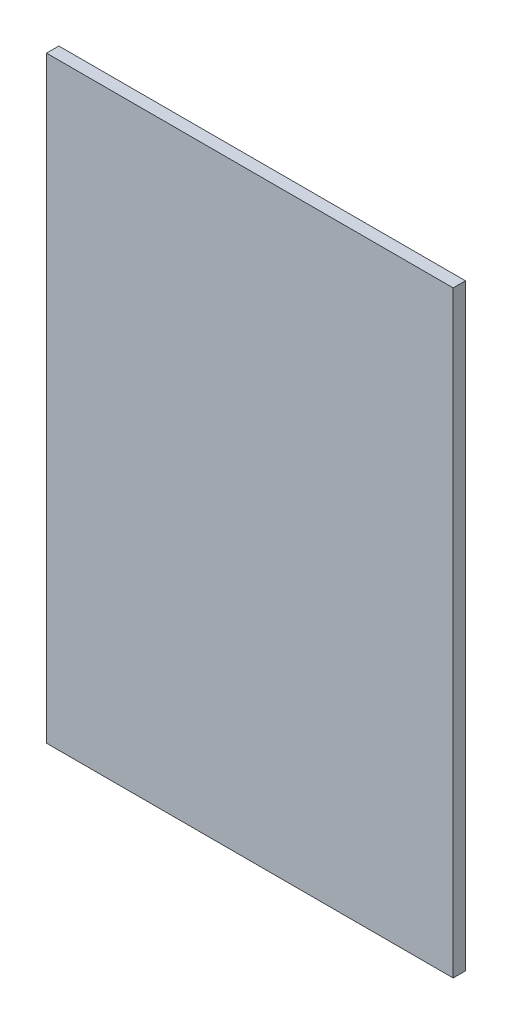
ISO-10303-21;
HEADER;
FILE_DESCRIPTION(('STEP AP214'),'2;1');
FILE_NAME('part.step','',(''),(''),'','','');
FILE_SCHEMA(('AUTOMOTIVE_DESIGN { 1 0 10303 214 1 1 1 1 }'));
ENDSEC;
DATA;
#1=APPLICATION_CONTEXT('core data for automotive mechanical design processes');
#2=APPLICATION_PROTOCOL_DEFINITION('international standard','automotive_design',2000,#1);
#3=PRODUCT_CONTEXT('',#1,'mechanical');
#4=PRODUCT('Part','Part','',(#3));
#5=PRODUCT_RELATED_PRODUCT_CATEGORY('part','',(#4));
#6=PRODUCT_DEFINITION_FORMATION('','',#4);
#7=PRODUCT_DEFINITION_CONTEXT('part definition',#1,'design');
#8=PRODUCT_DEFINITION('design','',#6,#7);
#9=PRODUCT_DEFINITION_SHAPE('','',#8);
#10=(LENGTH_UNIT() NAMED_UNIT(*) SI_UNIT(.MILLI.,.METRE.));
#11=(NAMED_UNIT(*) PLANE_ANGLE_UNIT() SI_UNIT($,.RADIAN.));
#12=(NAMED_UNIT(*) SI_UNIT($,.STERADIAN.) SOLID_ANGLE_UNIT());
#13=UNCERTAINTY_MEASURE_WITH_UNIT(LENGTH_MEASURE(1.E-05),#10,'distance_accuracy_value','');
#14=(GEOMETRIC_REPRESENTATION_CONTEXT(3) GLOBAL_UNCERTAINTY_ASSIGNED_CONTEXT((#13)) GLOBAL_UNIT_ASSIGNED_CONTEXT((#10,
#11,#12)) REPRESENTATION_CONTEXT('',''));
#15=CARTESIAN_POINT('',(0.,0.,0.));
#16=DIRECTION('',(0.,0.,1.));
#17=DIRECTION('',(1.,0.,0.));
#18=AXIS2_PLACEMENT_3D('',#15,#16,#17);
#19=CARTESIAN_POINT('',(-57.2916054463415,66.9890041493776,2.));
#20=DIRECTION('',(1.,0.,0.));
#21=DIRECTION('',(0.,1.,0.));
#22=AXIS2_PLACEMENT_3D('',#19,#20,#21);
#23=PLANE('',#22);
#24=DIRECTION('',(0.,-1.,0.));
#25=VECTOR('',#24,1.);
#26=CARTESIAN_POINT('',(-57.2916054463415,66.9890041493776,0.));
#27=LINE('',#26,#25);
#28=CARTESIAN_POINT('',(-57.2916054463415,66.9890041493776,0.));
#29=VERTEX_POINT('',#28);
#30=CARTESIAN_POINT('',(-57.2916054463415,-30.0109958506224,0.));
#31=VERTEX_POINT('',#30);
#32=EDGE_CURVE('E96',#29,#31,#27,.T.);
#33=ORIENTED_EDGE('',*,*,#32,.T.);
#34=DIRECTION('',(0.,0.,-1.));
#35=VECTOR('',#34,1.);
#36=CARTESIAN_POINT('',(-57.2916054463415,-30.0109958506224,2.));
#37=LINE('',#36,#35);
#38=CARTESIAN_POINT('',(-57.2916054463415,-30.0109958506224,2.));
#39=VERTEX_POINT('',#38);
#40=EDGE_CURVE('E11',#39,#31,#37,.T.);
#41=ORIENTED_EDGE('',*,*,#40,.F.);
#42=DIRECTION('',(0.,-1.,0.));
#43=VECTOR('',#42,1.);
#44=CARTESIAN_POINT('',(-57.2916054463415,66.9890041493776,2.));
#45=LINE('',#44,#43);
#46=CARTESIAN_POINT('',(-57.2916054463415,66.9890041493776,2.));
#47=VERTEX_POINT('',#46);
#48=EDGE_CURVE('E84',#47,#39,#45,.T.);
#49=ORIENTED_EDGE('',*,*,#48,.F.);
#50=DIRECTION('',(0.,0.,-1.));
#51=VECTOR('',#50,1.);
#52=CARTESIAN_POINT('',(-57.2916054463415,66.9890041493776,2.));
#53=LINE('',#52,#51);
#54=EDGE_CURVE('E92',#47,#29,#53,.T.);
#55=ORIENTED_EDGE('',*,*,#54,.T.);
#56=EDGE_LOOP('',(#33,#41,#49,#55));
#57=FACE_BOUND('',#56,.T.);
#58=ADVANCED_FACE('F33',(#57),#23,.F.);
#59=CARTESIAN_POINT('',(-57.2916054463415,-30.0109958506224,2.));
#60=DIRECTION('',(0.,1.,0.));
#61=DIRECTION('',(0.,0.,1.));
#62=AXIS2_PLACEMENT_3D('',#59,#60,#61);
#63=PLANE('',#62);
#64=DIRECTION('',(1.,0.,0.));
#65=VECTOR('',#64,1.);
#66=CARTESIAN_POINT('',(-57.2916054463415,-30.0109958506224,0.));
#67=LINE('',#66,#65);
#68=CARTESIAN_POINT('',(8.70839455365849,-30.0109958506224,0.));
#69=VERTEX_POINT('',#68);
#70=EDGE_CURVE('E88',#31,#69,#67,.T.);
#71=ORIENTED_EDGE('',*,*,#70,.T.);
#72=DIRECTION('',(0.,0.,-1.));
#73=VECTOR('',#72,1.);
#74=CARTESIAN_POINT('',(8.70839455365849,-30.0109958506224,2.));
#75=LINE('',#74,#73);
#76=CARTESIAN_POINT('',(8.70839455365849,-30.0109958506224,2.));
#77=VERTEX_POINT('',#76);
#78=EDGE_CURVE('E41',#77,#69,#75,.T.);
#79=ORIENTED_EDGE('',*,*,#78,.F.);
#80=DIRECTION('',(1.,0.,0.));
#81=VECTOR('',#80,1.);
#82=CARTESIAN_POINT('',(-57.2916054463415,-30.0109958506224,2.));
#83=LINE('',#82,#81);
#84=EDGE_CURVE('E79',#39,#77,#83,.T.);
#85=ORIENTED_EDGE('',*,*,#84,.F.);
#86=ORIENTED_EDGE('',*,*,#40,.T.);
#87=EDGE_LOOP('',(#71,#79,#85,#86));
#88=FACE_BOUND('',#87,.T.);
#89=ADVANCED_FACE('F87',(#88),#63,.F.);
#90=CARTESIAN_POINT('',(8.70839455365848,66.9890041493776,2.));
#91=DIRECTION('',(-1.,0.,0.));
#92=DIRECTION('',(0.,-1.,0.));
#93=AXIS2_PLACEMENT_3D('',#90,#91,#92);
#94=PLANE('',#93);
#95=DIRECTION('',(0.,1.,0.));
#96=VECTOR('',#95,1.);
#97=CARTESIAN_POINT('',(8.70839455365848,66.9890041493776,0.));
#98=LINE('',#97,#96);
#99=CARTESIAN_POINT('',(8.70839455365848,66.9890041493776,0.));
#100=VERTEX_POINT('',#99);
#101=EDGE_CURVE('E66',#69,#100,#98,.T.);
#102=ORIENTED_EDGE('',*,*,#101,.T.);
#103=DIRECTION('',(0.,0.,-1.));
#104=VECTOR('',#103,1.);
#105=CARTESIAN_POINT('',(8.70839455365848,66.9890041493776,2.));
#106=LINE('',#105,#104);
#107=CARTESIAN_POINT('',(8.70839455365848,66.9890041493776,2.));
#108=VERTEX_POINT('',#107);
#109=EDGE_CURVE('E89',#108,#100,#106,.T.);
#110=ORIENTED_EDGE('',*,*,#109,.F.);
#111=DIRECTION('',(0.,1.,0.));
#112=VECTOR('',#111,1.);
#113=CARTESIAN_POINT('',(8.70839455365848,66.9890041493776,2.));
#114=LINE('',#113,#112);
#115=EDGE_CURVE('E82',#77,#108,#114,.T.);
#116=ORIENTED_EDGE('',*,*,#115,.F.);
#117=ORIENTED_EDGE('',*,*,#78,.T.);
#118=EDGE_LOOP('',(#102,#110,#116,#117));
#119=FACE_BOUND('',#118,.T.);
#120=ADVANCED_FACE('F90',(#119),#94,.F.);
#121=CARTESIAN_POINT('',(-57.2916054463415,66.9890041493776,2.));
#122=DIRECTION('',(0.,-1.,0.));
#123=DIRECTION('',(0.,0.,-1.));
#124=AXIS2_PLACEMENT_3D('',#121,#122,#123);
#125=PLANE('',#124);
#126=DIRECTION('',(-1.,0.,0.));
#127=VECTOR('',#126,1.);
#128=CARTESIAN_POINT('',(-57.2916054463415,66.9890041493776,0.));
#129=LINE('',#128,#127);
#130=EDGE_CURVE('E72',#100,#29,#129,.T.);
#131=ORIENTED_EDGE('',*,*,#130,.T.);
#132=ORIENTED_EDGE('',*,*,#54,.F.);
#133=DIRECTION('',(-1.,0.,0.));
#134=VECTOR('',#133,1.);
#135=CARTESIAN_POINT('',(-57.2916054463415,66.9890041493776,2.));
#136=LINE('',#135,#134);
#137=EDGE_CURVE('E49',#108,#47,#136,.T.);
#138=ORIENTED_EDGE('',*,*,#137,.F.);
#139=ORIENTED_EDGE('',*,*,#109,.T.);
#140=EDGE_LOOP('',(#131,#132,#138,#139));
#141=FACE_BOUND('',#140,.T.);
#142=ADVANCED_FACE('F103',(#141),#125,.F.);
#143=CARTESIAN_POINT('',(0.,0.,2.));
#144=DIRECTION('',(0.,0.,1.));
#145=DIRECTION('',(1.,0.,0.));
#146=AXIS2_PLACEMENT_3D('',#143,#144,#145);
#147=PLANE('',#146);
#148=ORIENTED_EDGE('',*,*,#48,.T.);
#149=ORIENTED_EDGE('',*,*,#84,.T.);
#150=ORIENTED_EDGE('',*,*,#115,.T.);
#151=ORIENTED_EDGE('',*,*,#137,.T.);
#152=EDGE_LOOP('',(#148,#149,#150,#151));
#153=FACE_BOUND('',#152,.T.);
#154=ADVANCED_FACE('F80',(#153),#147,.T.);
#155=CARTESIAN_POINT('',(0.,0.,0.));
#156=DIRECTION('',(0.,0.,1.));
#157=DIRECTION('',(1.,0.,0.));
#158=AXIS2_PLACEMENT_3D('',#155,#156,#157);
#159=PLANE('',#158);
#160=ORIENTED_EDGE('',*,*,#32,.F.);
#161=ORIENTED_EDGE('',*,*,#130,.F.);
#162=ORIENTED_EDGE('',*,*,#101,.F.);
#163=ORIENTED_EDGE('',*,*,#70,.F.);
#164=EDGE_LOOP('',(#160,#161,#162,#163));
#165=FACE_BOUND('',#164,.T.);
#166=ADVANCED_FACE('F106',(#165),#159,.F.);
#167=CLOSED_SHELL('',(#58,#89,#120,#142,#154,#166));
#168=MANIFOLD_SOLID_BREP('B2',#167);
#169=ADVANCED_BREP_SHAPE_REPRESENTATION('',(#18,#168),#14);
#170=SHAPE_DEFINITION_REPRESENTATION(#9,#169);
ENDSEC;
END-ISO-10303-21;
